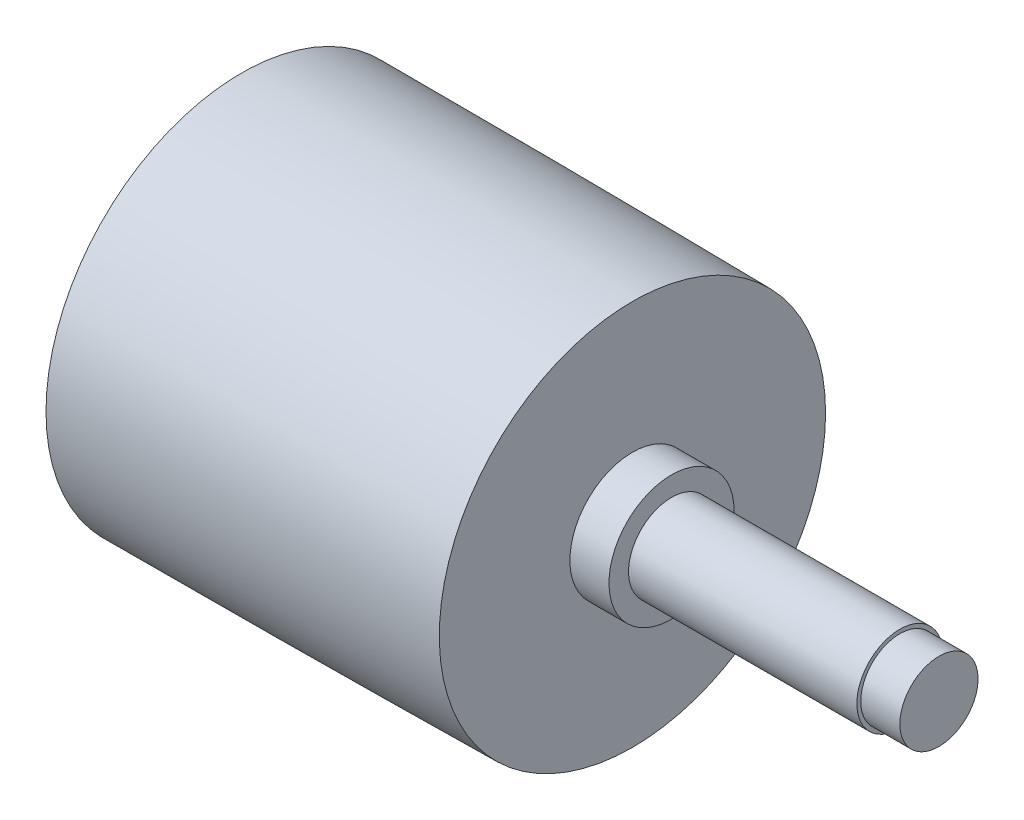
ISO-10303-21;
HEADER;
FILE_DESCRIPTION(('STEP AP214'),'2;1');
FILE_NAME('part.step','',(''),(''),'','','');
FILE_SCHEMA(('AUTOMOTIVE_DESIGN { 1 0 10303 214 1 1 1 1 }'));
ENDSEC;
DATA;
#1=APPLICATION_CONTEXT('core data for automotive mechanical design processes');
#2=APPLICATION_PROTOCOL_DEFINITION('international standard','automotive_design',2000,#1);
#3=PRODUCT_CONTEXT('',#1,'mechanical');
#4=PRODUCT('Part','Part','',(#3));
#5=PRODUCT_RELATED_PRODUCT_CATEGORY('part','',(#4));
#6=PRODUCT_DEFINITION_FORMATION('','',#4);
#7=PRODUCT_DEFINITION_CONTEXT('part definition',#1,'design');
#8=PRODUCT_DEFINITION('design','',#6,#7);
#9=PRODUCT_DEFINITION_SHAPE('','',#8);
#10=(LENGTH_UNIT() NAMED_UNIT(*) SI_UNIT(.MILLI.,.METRE.));
#11=(NAMED_UNIT(*) PLANE_ANGLE_UNIT() SI_UNIT($,.RADIAN.));
#12=(NAMED_UNIT(*) SI_UNIT($,.STERADIAN.) SOLID_ANGLE_UNIT());
#13=UNCERTAINTY_MEASURE_WITH_UNIT(LENGTH_MEASURE(1.E-05),#10,'distance_accuracy_value','');
#14=(GEOMETRIC_REPRESENTATION_CONTEXT(3) GLOBAL_UNCERTAINTY_ASSIGNED_CONTEXT((#13)) GLOBAL_UNIT_ASSIGNED_CONTEXT((#10,
#11,#12)) REPRESENTATION_CONTEXT('',''));
#15=CARTESIAN_POINT('',(0.,0.,0.));
#16=DIRECTION('',(0.,0.,1.));
#17=DIRECTION('',(1.,0.,0.));
#18=AXIS2_PLACEMENT_3D('',#15,#16,#17);
#19=CARTESIAN_POINT('',(-26.9950755436057,8.24786516853933,0.));
#20=DIRECTION('',(1.,0.,0.));
#21=DIRECTION('',(0.,0.617753922452919,-0.786371471566735));
#22=AXIS2_PLACEMENT_3D('',#19,#20,#21);
#23=CYLINDRICAL_SURFACE('',#22,5.5);
#24=CARTESIAN_POINT('',(7.20492445639428,8.24786516853933,0.));
#25=DIRECTION('',(-1.,0.,0.));
#26=DIRECTION('',(0.,-0.617753922452919,0.786371471566735));
#27=AXIS2_PLACEMENT_3D('',#24,#25,#26);
#28=CIRCLE('',#27,5.5);
#29=CARTESIAN_POINT('',(7.20492445639428,4.85021859504827,4.32504309361704));
#30=VERTEX_POINT('',#29);
#31=EDGE_CURVE('E177',#30,#30,#28,.T.);
#32=ORIENTED_EDGE('',*,*,#31,.T.);
#33=EDGE_LOOP('',(#32));
#34=FACE_BOUND('',#33,.T.);
#35=CARTESIAN_POINT('',(-21.9950755436057,8.24786516853933,0.));
#36=DIRECTION('',(-1.,0.,0.));
#37=DIRECTION('',(0.,-0.617753922452919,0.786371471566735));
#38=AXIS2_PLACEMENT_3D('',#35,#36,#37);
#39=CIRCLE('',#38,5.5);
#40=CARTESIAN_POINT('',(-21.9950755436057,4.85021859504827,4.32504309361704));
#41=VERTEX_POINT('',#40);
#42=EDGE_CURVE('E38',#41,#41,#39,.T.);
#43=ORIENTED_EDGE('',*,*,#42,.F.);
#44=EDGE_LOOP('',(#43));
#45=FACE_BOUND('',#44,.T.);
#46=ADVANCED_FACE('F35',(#34,#45),#23,.T.);
#47=CARTESIAN_POINT('',(7.20492445639428,8.24786516853933,0.));
#48=DIRECTION('',(-1.,0.,0.));
#49=DIRECTION('',(0.,-0.617753922452919,0.786371471566735));
#50=AXIS2_PLACEMENT_3D('',#47,#48,#49);
#51=PLANE('',#50);
#52=CARTESIAN_POINT('',(7.20492445639428,8.24786516853933,0.));
#53=DIRECTION('',(1.,0.,0.));
#54=DIRECTION('',(0.,0.617753922452919,-0.786371471566735));
#55=AXIS2_PLACEMENT_3D('',#52,#53,#54);
#56=CIRCLE('',#55,5.);
#57=CARTESIAN_POINT('',(7.20492445639428,11.3366347808039,-3.93185735783368));
#58=VERTEX_POINT('',#57);
#59=EDGE_CURVE('E11',#58,#58,#56,.T.);
#60=ORIENTED_EDGE('',*,*,#59,.F.);
#61=EDGE_LOOP('',(#60));
#62=FACE_BOUND('',#61,.T.);
#63=ORIENTED_EDGE('',*,*,#31,.F.);
#64=EDGE_LOOP('',(#63));
#65=FACE_BOUND('',#64,.T.);
#66=ADVANCED_FACE('F189',(#62,#65),#51,.F.);
#67=CARTESIAN_POINT('',(-21.9950755436057,8.24786516853933,0.));
#68=DIRECTION('',(-1.,0.,0.));
#69=DIRECTION('',(0.,-0.617753922452919,0.786371471566735));
#70=AXIS2_PLACEMENT_3D('',#67,#68,#69);
#71=CYLINDRICAL_SURFACE('',#70,8.);
#72=CARTESIAN_POINT('',(-21.9950755436057,8.24786516853933,0.));
#73=DIRECTION('',(-1.,0.,0.));
#74=DIRECTION('',(0.,-0.617753922452919,0.786371471566735));
#75=AXIS2_PLACEMENT_3D('',#72,#73,#74);
#76=CIRCLE('',#75,8.);
#77=CARTESIAN_POINT('',(-21.9950755436057,3.30583378891597,6.29097177253388));
#78=VERTEX_POINT('',#77);
#79=EDGE_CURVE('E174',#78,#78,#76,.T.);
#80=ORIENTED_EDGE('',*,*,#79,.T.);
#81=EDGE_LOOP('',(#80));
#82=FACE_BOUND('',#81,.T.);
#83=CARTESIAN_POINT('',(-26.9950755436057,8.24786516853933,0.));
#84=DIRECTION('',(-1.,0.,0.));
#85=DIRECTION('',(0.,-0.617753922452919,0.786371471566735));
#86=AXIS2_PLACEMENT_3D('',#83,#84,#85);
#87=CIRCLE('',#86,8.);
#88=CARTESIAN_POINT('',(-26.9950755436057,3.30583378891597,6.29097177253388));
#89=VERTEX_POINT('',#88);
#90=EDGE_CURVE('E172',#89,#89,#87,.T.);
#91=ORIENTED_EDGE('',*,*,#90,.F.);
#92=EDGE_LOOP('',(#91));
#93=FACE_BOUND('',#92,.T.);
#94=ADVANCED_FACE('F194',(#82,#93),#71,.T.);
#95=CARTESIAN_POINT('',(-21.9950755436057,8.24786516853933,0.));
#96=DIRECTION('',(-1.,0.,0.));
#97=DIRECTION('',(0.,-0.617753922452919,0.786371471566735));
#98=AXIS2_PLACEMENT_3D('',#95,#96,#97);
#99=PLANE('',#98);
#100=ORIENTED_EDGE('',*,*,#42,.T.);
#101=EDGE_LOOP('',(#100));
#102=FACE_BOUND('',#101,.T.);
#103=ORIENTED_EDGE('',*,*,#79,.F.);
#104=EDGE_LOOP('',(#103));
#105=FACE_BOUND('',#104,.T.);
#106=ADVANCED_FACE('F185',(#102,#105),#99,.F.);
#107=CARTESIAN_POINT('',(12.2049244563943,8.24786516853933,0.));
#108=DIRECTION('',(-1.,0.,0.));
#109=DIRECTION('',(0.,-0.617753922452919,0.786371471566735));
#110=AXIS2_PLACEMENT_3D('',#107,#108,#109);
#111=CYLINDRICAL_SURFACE('',#110,5.);
#112=CARTESIAN_POINT('',(12.2049244563943,8.24786516853933,0.));
#113=DIRECTION('',(1.,0.,0.));
#114=DIRECTION('',(0.,0.617753922452919,-0.786371471566735));
#115=AXIS2_PLACEMENT_3D('',#112,#113,#114);
#116=CIRCLE('',#115,5.);
#117=CARTESIAN_POINT('',(12.2049244563943,11.3366347808039,-3.93185735783368));
#118=VERTEX_POINT('',#117);
#119=EDGE_CURVE('E170',#118,#118,#116,.T.);
#120=ORIENTED_EDGE('',*,*,#119,.F.);
#121=EDGE_LOOP('',(#120));
#122=FACE_BOUND('',#121,.T.);
#123=ORIENTED_EDGE('',*,*,#59,.T.);
#124=EDGE_LOOP('',(#123));
#125=FACE_BOUND('',#124,.T.);
#126=ADVANCED_FACE('F207',(#122,#125),#111,.T.);
#127=CARTESIAN_POINT('',(12.2049244563943,8.24786516853933,0.));
#128=DIRECTION('',(1.,0.,0.));
#129=DIRECTION('',(0.,0.617753922452919,-0.786371471566735));
#130=AXIS2_PLACEMENT_3D('',#127,#128,#129);
#131=PLANE('',#130);
#132=ORIENTED_EDGE('',*,*,#119,.T.);
#133=EDGE_LOOP('',(#132));
#134=FACE_BOUND('',#133,.T.);
#135=ADVANCED_FACE('F210',(#134),#131,.T.);
#136=CARTESIAN_POINT('',(-26.9950755436057,30.2478651685393,0.));
#137=DIRECTION('',(-1.,0.,0.));
#138=DIRECTION('',(0.,0.,1.));
#139=AXIS2_PLACEMENT_3D('',#136,#137,#138);
#140=PLANE('',#139);
#141=ORIENTED_EDGE('',*,*,#90,.T.);
#142=EDGE_LOOP('',(#141));
#143=FACE_BOUND('',#142,.T.);
#144=CARTESIAN_POINT('',(-26.9950755436056,8.24786516853933,0.));
#145=DIRECTION('',(-1.,0.,0.));
#146=DIRECTION('',(0.,-1.,0.));
#147=AXIS2_PLACEMENT_3D('',#144,#145,#146);
#148=CIRCLE('',#147,24.7000000000002);
#149=CARTESIAN_POINT('',(-26.9950755436056,-16.4521348314608,0.));
#150=VERTEX_POINT('',#149);
#151=EDGE_CURVE('E167',#150,#150,#148,.T.);
#152=ORIENTED_EDGE('',*,*,#151,.F.);
#153=EDGE_LOOP('',(#152));
#154=FACE_BOUND('',#153,.T.);
#155=ADVANCED_FACE('F214',(#143,#154),#140,.F.);
#156=CARTESIAN_POINT('',(-76.9950755436057,8.24786516853933,0.));
#157=DIRECTION('',(-1.,0.,0.));
#158=DIRECTION('',(0.,-1.,0.));
#159=AXIS2_PLACEMENT_3D('',#156,#157,#158);
#160=DEGENERATE_TOROIDAL_SURFACE('',#159,4141.81666666664,4166.81666666664,.F.);
#161=CARTESIAN_POINT('',(-76.9950755436057,8.24786516853933,0.));
#162=DIRECTION('',(1.,0.,0.));
#163=DIRECTION('',(0.,0.,-1.));
#164=AXIS2_PLACEMENT_3D('',#161,#162,#163);
#165=CIRCLE('',#164,25.);
#166=CARTESIAN_POINT('',(-76.9950755436057,8.24786516853933,-25.));
#167=VERTEX_POINT('',#166);
#168=EDGE_CURVE('E155',#167,#167,#165,.T.);
#169=ORIENTED_EDGE('',*,*,#168,.T.);
#170=EDGE_LOOP('',(#169));
#171=FACE_BOUND('',#170,.T.);
#172=ORIENTED_EDGE('',*,*,#151,.T.);
#173=EDGE_LOOP('',(#172));
#174=FACE_BOUND('',#173,.T.);
#175=ADVANCED_FACE('F220',(#171,#174),#160,.F.);
#176=CARTESIAN_POINT('',(-76.9950755436057,8.24786516853933,0.));
#177=DIRECTION('',(1.,0.,0.));
#178=DIRECTION('',(0.,0.,-1.));
#179=AXIS2_PLACEMENT_3D('',#176,#177,#178);
#180=PLANE('',#179);
#181=DIRECTION('',(0.,1.,0.));
#182=VECTOR('',#181,1.);
#183=CARTESIAN_POINT('',(-76.9950755436057,17.8478651685393,12.6));
#184=LINE('',#183,#182);
#185=CARTESIAN_POINT('',(-76.9950755436057,-1.35213483146067,12.6));
#186=VERTEX_POINT('',#185);
#187=CARTESIAN_POINT('',(-76.9950755436057,17.8478651685393,12.6));
#188=VERTEX_POINT('',#187);
#189=EDGE_CURVE('E136',#186,#188,#184,.T.);
#190=ORIENTED_EDGE('',*,*,#189,.F.);
#191=CARTESIAN_POINT('',(-76.9950755436057,-1.35213483146067,9.6));
#192=DIRECTION('',(-1.,0.,0.));
#193=DIRECTION('',(0.,0.,1.));
#194=AXIS2_PLACEMENT_3D('',#191,#192,#193);
#195=CIRCLE('',#194,3.);
#196=CARTESIAN_POINT('',(-76.9950755436057,-4.35213483146067,9.6));
#197=VERTEX_POINT('',#196);
#198=EDGE_CURVE('E50',#197,#186,#195,.T.);
#199=ORIENTED_EDGE('',*,*,#198,.F.);
#200=DIRECTION('',(0.,0.,1.));
#201=VECTOR('',#200,1.);
#202=CARTESIAN_POINT('',(-76.9950755436057,-4.35213483146067,-9.6));
#203=LINE('',#202,#201);
#204=CARTESIAN_POINT('',(-76.9950755436057,-4.35213483146067,-9.6));
#205=VERTEX_POINT('',#204);
#206=EDGE_CURVE('E151',#205,#197,#203,.T.);
#207=ORIENTED_EDGE('',*,*,#206,.F.);
#208=CARTESIAN_POINT('',(-76.9950755436057,-1.35213483146067,-9.6));
#209=DIRECTION('',(-1.,0.,0.));
#210=DIRECTION('',(0.,0.,1.));
#211=AXIS2_PLACEMENT_3D('',#208,#209,#210);
#212=CIRCLE('',#211,3.);
#213=CARTESIAN_POINT('',(-76.9950755436057,-1.35213483146067,-12.6));
#214=VERTEX_POINT('',#213);
#215=EDGE_CURVE('E149',#214,#205,#212,.T.);
#216=ORIENTED_EDGE('',*,*,#215,.F.);
#217=DIRECTION('',(0.,-1.,0.));
#218=VECTOR('',#217,1.);
#219=CARTESIAN_POINT('',(-76.9950755436057,17.8478651685393,-12.6));
#220=LINE('',#219,#218);
#221=CARTESIAN_POINT('',(-76.9950755436057,17.8478651685393,-12.6));
#222=VERTEX_POINT('',#221);
#223=EDGE_CURVE('E110',#222,#214,#220,.T.);
#224=ORIENTED_EDGE('',*,*,#223,.F.);
#225=CARTESIAN_POINT('',(-76.9950755436057,17.8478651685393,-9.6));
#226=DIRECTION('',(-1.,0.,0.));
#227=DIRECTION('',(0.,0.,1.));
#228=AXIS2_PLACEMENT_3D('',#225,#226,#227);
#229=CIRCLE('',#228,3.);
#230=CARTESIAN_POINT('',(-76.9950755436057,20.8478651685393,-9.6));
#231=VERTEX_POINT('',#230);
#232=EDGE_CURVE('E145',#231,#222,#229,.T.);
#233=ORIENTED_EDGE('',*,*,#232,.F.);
#234=DIRECTION('',(0.,0.,-1.));
#235=VECTOR('',#234,1.);
#236=CARTESIAN_POINT('',(-76.9950755436057,20.8478651685393,-9.6));
#237=LINE('',#236,#235);
#238=CARTESIAN_POINT('',(-76.9950755436057,20.8478651685393,9.6));
#239=VERTEX_POINT('',#238);
#240=EDGE_CURVE('E142',#239,#231,#237,.T.);
#241=ORIENTED_EDGE('',*,*,#240,.F.);
#242=CARTESIAN_POINT('',(-76.9950755436057,17.8478651685393,9.6));
#243=DIRECTION('',(-1.,0.,0.));
#244=DIRECTION('',(0.,0.,-1.));
#245=AXIS2_PLACEMENT_3D('',#242,#243,#244);
#246=CIRCLE('',#245,3.);
#247=EDGE_CURVE('E139',#188,#239,#246,.T.);
#248=ORIENTED_EDGE('',*,*,#247,.F.);
#249=EDGE_LOOP('',(#190,#199,#207,#216,#224,#233,#241,#248));
#250=FACE_BOUND('',#249,.T.);
#251=ORIENTED_EDGE('',*,*,#168,.F.);
#252=EDGE_LOOP('',(#251));
#253=FACE_BOUND('',#252,.T.);
#254=ADVANCED_FACE('F216',(#250,#253),#180,.F.);
#255=CARTESIAN_POINT('',(-66.9950755436058,-1.35213483146067,9.6));
#256=DIRECTION('',(-1.,0.,0.));
#257=DIRECTION('',(0.,0.,1.));
#258=AXIS2_PLACEMENT_3D('',#255,#256,#257);
#259=CYLINDRICAL_SURFACE('',#258,3.);
#260=ORIENTED_EDGE('',*,*,#198,.T.);
#261=DIRECTION('',(-1.,0.,0.));
#262=VECTOR('',#261,1.);
#263=CARTESIAN_POINT('',(-66.9950755436058,-1.35213483146067,12.6));
#264=LINE('',#263,#262);
#265=CARTESIAN_POINT('',(-66.9950755436058,-1.35213483146067,12.6));
#266=VERTEX_POINT('',#265);
#267=EDGE_CURVE('E86',#266,#186,#264,.T.);
#268=ORIENTED_EDGE('',*,*,#267,.F.);
#269=CARTESIAN_POINT('',(-66.9950755436058,-1.35213483146067,9.6));
#270=DIRECTION('',(-1.,0.,0.));
#271=DIRECTION('',(0.,0.,1.));
#272=AXIS2_PLACEMENT_3D('',#269,#270,#271);
#273=CIRCLE('',#272,3.);
#274=CARTESIAN_POINT('',(-66.9950755436058,-4.35213483146067,9.6));
#275=VERTEX_POINT('',#274);
#276=EDGE_CURVE('E153',#275,#266,#273,.T.);
#277=ORIENTED_EDGE('',*,*,#276,.F.);
#278=DIRECTION('',(-1.,0.,0.));
#279=VECTOR('',#278,1.);
#280=CARTESIAN_POINT('',(-66.9950755436058,-4.35213483146067,9.6));
#281=LINE('',#280,#279);
#282=EDGE_CURVE('E58',#275,#197,#281,.T.);
#283=ORIENTED_EDGE('',*,*,#282,.T.);
#284=EDGE_LOOP('',(#260,#268,#277,#283));
#285=FACE_BOUND('',#284,.T.);
#286=ADVANCED_FACE('F219',(#285),#259,.F.);
#287=CARTESIAN_POINT('',(-66.9950755436058,-4.35213483146067,-9.6));
#288=DIRECTION('',(0.,-1.,0.));
#289=DIRECTION('',(0.,0.,-1.));
#290=AXIS2_PLACEMENT_3D('',#287,#288,#289);
#291=PLANE('',#290);
#292=ORIENTED_EDGE('',*,*,#206,.T.);
#293=ORIENTED_EDGE('',*,*,#282,.F.);
#294=DIRECTION('',(0.,0.,1.));
#295=VECTOR('',#294,1.);
#296=CARTESIAN_POINT('',(-66.9950755436058,-4.35213483146067,-9.6));
#297=LINE('',#296,#295);
#298=CARTESIAN_POINT('',(-66.9950755436058,-4.35213483146067,-9.6));
#299=VERTEX_POINT('',#298);
#300=EDGE_CURVE('E122',#299,#275,#297,.T.);
#301=ORIENTED_EDGE('',*,*,#300,.F.);
#302=DIRECTION('',(-1.,0.,0.));
#303=VECTOR('',#302,1.);
#304=CARTESIAN_POINT('',(-66.9950755436058,-4.35213483146067,-9.6));
#305=LINE('',#304,#303);
#306=EDGE_CURVE('E114',#299,#205,#305,.T.);
#307=ORIENTED_EDGE('',*,*,#306,.T.);
#308=EDGE_LOOP('',(#292,#293,#301,#307));
#309=FACE_BOUND('',#308,.T.);
#310=ADVANCED_FACE('F230',(#309),#291,.F.);
#311=CARTESIAN_POINT('',(-66.9950755436058,-1.35213483146067,-9.6));
#312=DIRECTION('',(-1.,0.,0.));
#313=DIRECTION('',(0.,0.,1.));
#314=AXIS2_PLACEMENT_3D('',#311,#312,#313);
#315=CYLINDRICAL_SURFACE('',#314,3.);
#316=ORIENTED_EDGE('',*,*,#215,.T.);
#317=ORIENTED_EDGE('',*,*,#306,.F.);
#318=CARTESIAN_POINT('',(-66.9950755436058,-1.35213483146067,-9.6));
#319=DIRECTION('',(-1.,0.,0.));
#320=DIRECTION('',(0.,0.,1.));
#321=AXIS2_PLACEMENT_3D('',#318,#319,#320);
#322=CIRCLE('',#321,3.);
#323=CARTESIAN_POINT('',(-66.9950755436058,-1.35213483146067,-12.6));
#324=VERTEX_POINT('',#323);
#325=EDGE_CURVE('E118',#324,#299,#322,.T.);
#326=ORIENTED_EDGE('',*,*,#325,.F.);
#327=DIRECTION('',(-1.,0.,0.));
#328=VECTOR('',#327,1.);
#329=CARTESIAN_POINT('',(-66.9950755436058,-1.35213483146067,-12.6));
#330=LINE('',#329,#328);
#331=EDGE_CURVE('E103',#324,#214,#330,.T.);
#332=ORIENTED_EDGE('',*,*,#331,.T.);
#333=EDGE_LOOP('',(#316,#317,#326,#332));
#334=FACE_BOUND('',#333,.T.);
#335=ADVANCED_FACE('F119',(#334),#315,.F.);
#336=CARTESIAN_POINT('',(-66.9950755436058,17.8478651685393,-12.6));
#337=DIRECTION('',(0.,0.,-1.));
#338=DIRECTION('',(0.,1.,0.));
#339=AXIS2_PLACEMENT_3D('',#336,#337,#338);
#340=PLANE('',#339);
#341=ORIENTED_EDGE('',*,*,#223,.T.);
#342=ORIENTED_EDGE('',*,*,#331,.F.);
#343=DIRECTION('',(0.,-1.,0.));
#344=VECTOR('',#343,1.);
#345=CARTESIAN_POINT('',(-66.9950755436058,17.8478651685393,-12.6));
#346=LINE('',#345,#344);
#347=CARTESIAN_POINT('',(-66.9950755436058,17.8478651685393,-12.6));
#348=VERTEX_POINT('',#347);
#349=EDGE_CURVE('E107',#348,#324,#346,.T.);
#350=ORIENTED_EDGE('',*,*,#349,.F.);
#351=DIRECTION('',(-1.,0.,0.));
#352=VECTOR('',#351,1.);
#353=CARTESIAN_POINT('',(-66.9950755436058,17.8478651685393,-12.6));
#354=LINE('',#353,#352);
#355=EDGE_CURVE('E115',#348,#222,#354,.T.);
#356=ORIENTED_EDGE('',*,*,#355,.T.);
#357=EDGE_LOOP('',(#341,#342,#350,#356));
#358=FACE_BOUND('',#357,.T.);
#359=ADVANCED_FACE('F105',(#358),#340,.F.);
#360=CARTESIAN_POINT('',(-66.9950755436058,17.8478651685393,-9.6));
#361=DIRECTION('',(-1.,0.,0.));
#362=DIRECTION('',(0.,0.,1.));
#363=AXIS2_PLACEMENT_3D('',#360,#361,#362);
#364=CYLINDRICAL_SURFACE('',#363,3.);
#365=ORIENTED_EDGE('',*,*,#232,.T.);
#366=ORIENTED_EDGE('',*,*,#355,.F.);
#367=CARTESIAN_POINT('',(-66.9950755436058,17.8478651685393,-9.6));
#368=DIRECTION('',(-1.,0.,0.));
#369=DIRECTION('',(0.,0.,1.));
#370=AXIS2_PLACEMENT_3D('',#367,#368,#369);
#371=CIRCLE('',#370,3.);
#372=CARTESIAN_POINT('',(-66.9950755436058,20.8478651685393,-9.6));
#373=VERTEX_POINT('',#372);
#374=EDGE_CURVE('E128',#373,#348,#371,.T.);
#375=ORIENTED_EDGE('',*,*,#374,.F.);
#376=DIRECTION('',(-1.,0.,0.));
#377=VECTOR('',#376,1.);
#378=CARTESIAN_POINT('',(-66.9950755436058,20.8478651685393,-9.6));
#379=LINE('',#378,#377);
#380=EDGE_CURVE('E158',#373,#231,#379,.T.);
#381=ORIENTED_EDGE('',*,*,#380,.T.);
#382=EDGE_LOOP('',(#365,#366,#375,#381));
#383=FACE_BOUND('',#382,.T.);
#384=ADVANCED_FACE('F242',(#383),#364,.F.);
#385=CARTESIAN_POINT('',(-66.9950755436058,20.8478651685393,-9.6));
#386=DIRECTION('',(0.,1.,0.));
#387=DIRECTION('',(0.,0.,1.));
#388=AXIS2_PLACEMENT_3D('',#385,#386,#387);
#389=PLANE('',#388);
#390=ORIENTED_EDGE('',*,*,#240,.T.);
#391=ORIENTED_EDGE('',*,*,#380,.F.);
#392=DIRECTION('',(0.,0.,-1.));
#393=VECTOR('',#392,1.);
#394=CARTESIAN_POINT('',(-66.9950755436058,20.8478651685393,-9.6));
#395=LINE('',#394,#393);
#396=CARTESIAN_POINT('',(-66.9950755436058,20.8478651685393,9.6));
#397=VERTEX_POINT('',#396);
#398=EDGE_CURVE('E130',#397,#373,#395,.T.);
#399=ORIENTED_EDGE('',*,*,#398,.F.);
#400=DIRECTION('',(-1.,0.,0.));
#401=VECTOR('',#400,1.);
#402=CARTESIAN_POINT('',(-66.9950755436058,20.8478651685393,9.6));
#403=LINE('',#402,#401);
#404=EDGE_CURVE('E160',#397,#239,#403,.T.);
#405=ORIENTED_EDGE('',*,*,#404,.T.);
#406=EDGE_LOOP('',(#390,#391,#399,#405));
#407=FACE_BOUND('',#406,.T.);
#408=ADVANCED_FACE('F238',(#407),#389,.F.);
#409=CARTESIAN_POINT('',(-66.9950755436058,17.8478651685393,9.6));
#410=DIRECTION('',(-1.,0.,0.));
#411=DIRECTION('',(0.,0.,1.));
#412=AXIS2_PLACEMENT_3D('',#409,#410,#411);
#413=CYLINDRICAL_SURFACE('',#412,3.);
#414=ORIENTED_EDGE('',*,*,#247,.T.);
#415=ORIENTED_EDGE('',*,*,#404,.F.);
#416=CARTESIAN_POINT('',(-66.9950755436058,17.8478651685393,9.6));
#417=DIRECTION('',(-1.,0.,0.));
#418=DIRECTION('',(0.,0.,-1.));
#419=AXIS2_PLACEMENT_3D('',#416,#417,#418);
#420=CIRCLE('',#419,3.);
#421=CARTESIAN_POINT('',(-66.9950755436058,17.8478651685393,12.6));
#422=VERTEX_POINT('',#421);
#423=EDGE_CURVE('E374',#422,#397,#420,.T.);
#424=ORIENTED_EDGE('',*,*,#423,.F.);
#425=DIRECTION('',(-1.,0.,0.));
#426=VECTOR('',#425,1.);
#427=CARTESIAN_POINT('',(-66.9950755436058,17.8478651685393,12.6));
#428=LINE('',#427,#426);
#429=EDGE_CURVE('E162',#422,#188,#428,.T.);
#430=ORIENTED_EDGE('',*,*,#429,.T.);
#431=EDGE_LOOP('',(#414,#415,#424,#430));
#432=FACE_BOUND('',#431,.T.);
#433=ADVANCED_FACE('F234',(#432),#413,.F.);
#434=CARTESIAN_POINT('',(-66.9950755436058,17.8478651685393,12.6));
#435=DIRECTION('',(0.,0.,1.));
#436=DIRECTION('',(0.,-1.,0.));
#437=AXIS2_PLACEMENT_3D('',#434,#435,#436);
#438=PLANE('',#437);
#439=ORIENTED_EDGE('',*,*,#189,.T.);
#440=ORIENTED_EDGE('',*,*,#429,.F.);
#441=DIRECTION('',(0.,1.,0.));
#442=VECTOR('',#441,1.);
#443=CARTESIAN_POINT('',(-66.9950755436058,17.8478651685393,12.6));
#444=LINE('',#443,#442);
#445=EDGE_CURVE('E372',#266,#422,#444,.T.);
#446=ORIENTED_EDGE('',*,*,#445,.F.);
#447=ORIENTED_EDGE('',*,*,#267,.T.);
#448=EDGE_LOOP('',(#439,#440,#446,#447));
#449=FACE_BOUND('',#448,.T.);
#450=ADVANCED_FACE('F231',(#449),#438,.F.);
#451=CARTESIAN_POINT('',(-66.9950755436058,-1.35213483146067,9.6));
#452=DIRECTION('',(-1.,0.,0.));
#453=DIRECTION('',(0.,0.,1.));
#454=AXIS2_PLACEMENT_3D('',#451,#452,#453);
#455=PLANE('',#454);
#456=ORIENTED_EDGE('',*,*,#276,.T.);
#457=ORIENTED_EDGE('',*,*,#445,.T.);
#458=ORIENTED_EDGE('',*,*,#423,.T.);
#459=ORIENTED_EDGE('',*,*,#398,.T.);
#460=ORIENTED_EDGE('',*,*,#374,.T.);
#461=ORIENTED_EDGE('',*,*,#349,.T.);
#462=ORIENTED_EDGE('',*,*,#325,.T.);
#463=ORIENTED_EDGE('',*,*,#300,.T.);
#464=EDGE_LOOP('',(#456,#457,#458,#459,#460,#461,#462,#463));
#465=FACE_BOUND('',#464,.T.);
#466=ADVANCED_FACE('F125',(#465),#455,.T.);
#467=CLOSED_SHELL('',(#46,#66,#94,#106,#126,#135,#155,#175,#254,#286,#310,#335,#359,#384,#408,
#433,#450,#466));
#468=MANIFOLD_SOLID_BREP('B2',#467);
#469=ADVANCED_BREP_SHAPE_REPRESENTATION('',(#18,#468),#14);
#470=SHAPE_DEFINITION_REPRESENTATION(#9,#469);
ENDSEC;
END-ISO-10303-21;
